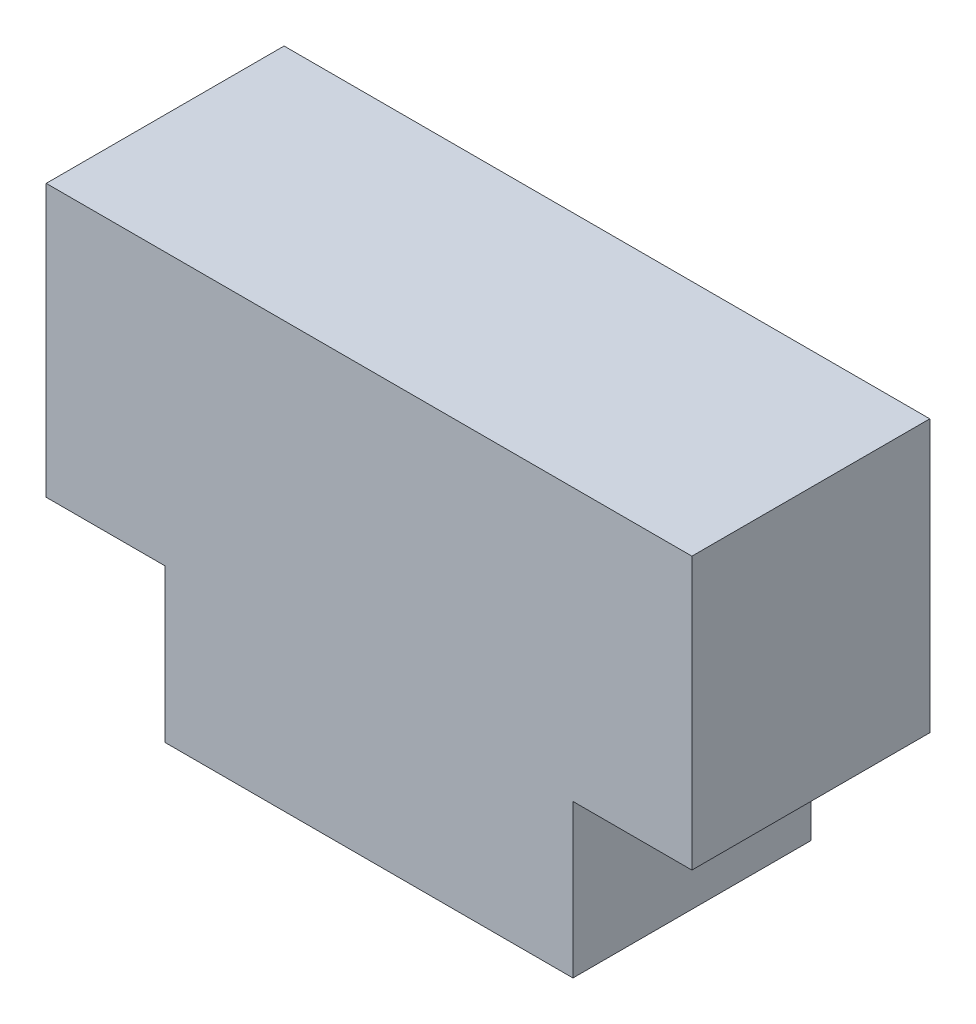
ISO-10303-21;
HEADER;
FILE_DESCRIPTION(('STEP AP214'),'2;1');
FILE_NAME('part.step','',(''),(''),'','','');
FILE_SCHEMA(('AUTOMOTIVE_DESIGN { 1 0 10303 214 1 1 1 1 }'));
ENDSEC;
DATA;
#1=APPLICATION_CONTEXT('core data for automotive mechanical design processes');
#2=APPLICATION_PROTOCOL_DEFINITION('international standard','automotive_design',2000,#1);
#3=PRODUCT_CONTEXT('',#1,'mechanical');
#4=PRODUCT('Part','Part','',(#3));
#5=PRODUCT_RELATED_PRODUCT_CATEGORY('part','',(#4));
#6=PRODUCT_DEFINITION_FORMATION('','',#4);
#7=PRODUCT_DEFINITION_CONTEXT('part definition',#1,'design');
#8=PRODUCT_DEFINITION('design','',#6,#7);
#9=PRODUCT_DEFINITION_SHAPE('','',#8);
#10=(LENGTH_UNIT() NAMED_UNIT(*) SI_UNIT(.MILLI.,.METRE.));
#11=(NAMED_UNIT(*) PLANE_ANGLE_UNIT() SI_UNIT($,.RADIAN.));
#12=(NAMED_UNIT(*) SI_UNIT($,.STERADIAN.) SOLID_ANGLE_UNIT());
#13=UNCERTAINTY_MEASURE_WITH_UNIT(LENGTH_MEASURE(1.E-05),#10,'distance_accuracy_value','');
#14=(GEOMETRIC_REPRESENTATION_CONTEXT(3) GLOBAL_UNCERTAINTY_ASSIGNED_CONTEXT((#13)) GLOBAL_UNIT_ASSIGNED_CONTEXT((#10,
#11,#12)) REPRESENTATION_CONTEXT('',''));
#15=CARTESIAN_POINT('',(0.,0.,0.));
#16=DIRECTION('',(0.,0.,1.));
#17=DIRECTION('',(1.,0.,0.));
#18=AXIS2_PLACEMENT_3D('',#15,#16,#17);
#19=CARTESIAN_POINT('',(0.95,-0.4,0.7));
#20=DIRECTION('',(-1.,0.,0.));
#21=DIRECTION('',(0.,0.,1.));
#22=AXIS2_PLACEMENT_3D('',#19,#20,#21);
#23=PLANE('',#22);
#24=DIRECTION('',(0.,1.,0.));
#25=VECTOR('',#24,1.);
#26=CARTESIAN_POINT('',(0.95,-0.4,0.));
#27=LINE('',#26,#25);
#28=CARTESIAN_POINT('',(0.95,-0.4,0.));
#29=VERTEX_POINT('',#28);
#30=CARTESIAN_POINT('',(0.95,0.4,0.));
#31=VERTEX_POINT('',#30);
#32=EDGE_CURVE('E130',#29,#31,#27,.T.);
#33=ORIENTED_EDGE('',*,*,#32,.T.);
#34=DIRECTION('',(0.,0.,-1.));
#35=VECTOR('',#34,1.);
#36=CARTESIAN_POINT('',(0.95,0.4,0.7));
#37=LINE('',#36,#35);
#38=CARTESIAN_POINT('',(0.95,0.4,0.7));
#39=VERTEX_POINT('',#38);
#40=EDGE_CURVE('E11',#39,#31,#37,.T.);
#41=ORIENTED_EDGE('',*,*,#40,.F.);
#42=DIRECTION('',(0.,1.,0.));
#43=VECTOR('',#42,1.);
#44=CARTESIAN_POINT('',(0.95,-0.4,0.7));
#45=LINE('',#44,#43);
#46=CARTESIAN_POINT('',(0.95,-0.4,0.7));
#47=VERTEX_POINT('',#46);
#48=EDGE_CURVE('E144',#47,#39,#45,.T.);
#49=ORIENTED_EDGE('',*,*,#48,.F.);
#50=DIRECTION('',(0.,0.,-1.));
#51=VECTOR('',#50,1.);
#52=CARTESIAN_POINT('',(0.95,-0.4,0.7));
#53=LINE('',#52,#51);
#54=EDGE_CURVE('E126',#47,#29,#53,.T.);
#55=ORIENTED_EDGE('',*,*,#54,.T.);
#56=EDGE_LOOP('',(#33,#41,#49,#55));
#57=FACE_BOUND('',#56,.T.);
#58=ADVANCED_FACE('F34',(#57),#23,.F.);
#59=CARTESIAN_POINT('',(0.95,0.4,0.7));
#60=DIRECTION('',(0.,-1.,0.));
#61=DIRECTION('',(0.,0.,-1.));
#62=AXIS2_PLACEMENT_3D('',#59,#60,#61);
#63=PLANE('',#62);
#64=DIRECTION('',(-1.,0.,0.));
#65=VECTOR('',#64,1.);
#66=CARTESIAN_POINT('',(0.95,0.4,0.));
#67=LINE('',#66,#65);
#68=CARTESIAN_POINT('',(-0.95,0.4,0.));
#69=VERTEX_POINT('',#68);
#70=EDGE_CURVE('E133',#31,#69,#67,.T.);
#71=ORIENTED_EDGE('',*,*,#70,.T.);
#72=DIRECTION('',(0.,0.,-1.));
#73=VECTOR('',#72,1.);
#74=CARTESIAN_POINT('',(-0.95,0.4,0.7));
#75=LINE('',#74,#73);
#76=CARTESIAN_POINT('',(-0.95,0.4,0.7));
#77=VERTEX_POINT('',#76);
#78=EDGE_CURVE('E42',#77,#69,#75,.T.);
#79=ORIENTED_EDGE('',*,*,#78,.F.);
#80=DIRECTION('',(-1.,0.,0.));
#81=VECTOR('',#80,1.);
#82=CARTESIAN_POINT('',(0.95,0.4,0.7));
#83=LINE('',#82,#81);
#84=EDGE_CURVE('E93',#39,#77,#83,.T.);
#85=ORIENTED_EDGE('',*,*,#84,.F.);
#86=ORIENTED_EDGE('',*,*,#40,.T.);
#87=EDGE_LOOP('',(#71,#79,#85,#86));
#88=FACE_BOUND('',#87,.T.);
#89=ADVANCED_FACE('F179',(#88),#63,.F.);
#90=CARTESIAN_POINT('',(-0.95,0.4,0.7));
#91=DIRECTION('',(1.,0.,0.));
#92=DIRECTION('',(0.,0.,-1.));
#93=AXIS2_PLACEMENT_3D('',#90,#91,#92);
#94=PLANE('',#93);
#95=DIRECTION('',(0.,-1.,0.));
#96=VECTOR('',#95,1.);
#97=CARTESIAN_POINT('',(-0.95,0.4,0.));
#98=LINE('',#97,#96);
#99=CARTESIAN_POINT('',(-0.95,-0.4,0.));
#100=VERTEX_POINT('',#99);
#101=EDGE_CURVE('E135',#69,#100,#98,.T.);
#102=ORIENTED_EDGE('',*,*,#101,.T.);
#103=DIRECTION('',(0.,0.,-1.));
#104=VECTOR('',#103,1.);
#105=CARTESIAN_POINT('',(-0.95,-0.4,0.7));
#106=LINE('',#105,#104);
#107=CARTESIAN_POINT('',(-0.95,-0.4,0.7));
#108=VERTEX_POINT('',#107);
#109=EDGE_CURVE('E151',#108,#100,#106,.T.);
#110=ORIENTED_EDGE('',*,*,#109,.F.);
#111=DIRECTION('',(0.,-1.,0.));
#112=VECTOR('',#111,1.);
#113=CARTESIAN_POINT('',(-0.95,0.4,0.7));
#114=LINE('',#113,#112);
#115=EDGE_CURVE('E159',#77,#108,#114,.T.);
#116=ORIENTED_EDGE('',*,*,#115,.F.);
#117=ORIENTED_EDGE('',*,*,#78,.T.);
#118=EDGE_LOOP('',(#102,#110,#116,#117));
#119=FACE_BOUND('',#118,.T.);
#120=ADVANCED_FACE('F157',(#119),#94,.F.);
#121=CARTESIAN_POINT('',(-0.95,-0.4,0.7));
#122=DIRECTION('',(0.,1.,0.));
#123=DIRECTION('',(0.,0.,1.));
#124=AXIS2_PLACEMENT_3D('',#121,#122,#123);
#125=PLANE('',#124);
#126=DIRECTION('',(1.,0.,0.));
#127=VECTOR('',#126,1.);
#128=CARTESIAN_POINT('',(-0.95,-0.4,0.));
#129=LINE('',#128,#127);
#130=CARTESIAN_POINT('',(-0.6,-0.4,0.));
#131=VERTEX_POINT('',#130);
#132=EDGE_CURVE('E137',#100,#131,#129,.T.);
#133=ORIENTED_EDGE('',*,*,#132,.T.);
#134=DIRECTION('',(0.,0.,-1.));
#135=VECTOR('',#134,1.);
#136=CARTESIAN_POINT('',(-0.6,-0.4,0.7));
#137=LINE('',#136,#135);
#138=CARTESIAN_POINT('',(-0.6,-0.4,0.7));
#139=VERTEX_POINT('',#138);
#140=EDGE_CURVE('E148',#139,#131,#137,.T.);
#141=ORIENTED_EDGE('',*,*,#140,.F.);
#142=DIRECTION('',(1.,0.,0.));
#143=VECTOR('',#142,1.);
#144=CARTESIAN_POINT('',(-0.95,-0.4,0.7));
#145=LINE('',#144,#143);
#146=EDGE_CURVE('E171',#108,#139,#145,.T.);
#147=ORIENTED_EDGE('',*,*,#146,.F.);
#148=ORIENTED_EDGE('',*,*,#109,.T.);
#149=EDGE_LOOP('',(#133,#141,#147,#148));
#150=FACE_BOUND('',#149,.T.);
#151=ADVANCED_FACE('F167',(#150),#125,.F.);
#152=CARTESIAN_POINT('',(-0.6,-0.4,0.7));
#153=DIRECTION('',(1.,0.,0.));
#154=DIRECTION('',(0.,0.,-1.));
#155=AXIS2_PLACEMENT_3D('',#152,#153,#154);
#156=PLANE('',#155);
#157=DIRECTION('',(0.,-1.,0.));
#158=VECTOR('',#157,1.);
#159=CARTESIAN_POINT('',(-0.6,-0.4,0.));
#160=LINE('',#159,#158);
#161=CARTESIAN_POINT('',(-0.6,-0.85,0.));
#162=VERTEX_POINT('',#161);
#163=EDGE_CURVE('E139',#131,#162,#160,.T.);
#164=ORIENTED_EDGE('',*,*,#163,.T.);
#165=DIRECTION('',(0.,0.,-1.));
#166=VECTOR('',#165,1.);
#167=CARTESIAN_POINT('',(-0.6,-0.85,0.7));
#168=LINE('',#167,#166);
#169=CARTESIAN_POINT('',(-0.6,-0.85,0.7));
#170=VERTEX_POINT('',#169);
#171=EDGE_CURVE('E121',#170,#162,#168,.T.);
#172=ORIENTED_EDGE('',*,*,#171,.F.);
#173=DIRECTION('',(0.,-1.,0.));
#174=VECTOR('',#173,1.);
#175=CARTESIAN_POINT('',(-0.6,-0.4,0.7));
#176=LINE('',#175,#174);
#177=EDGE_CURVE('E112',#139,#170,#176,.T.);
#178=ORIENTED_EDGE('',*,*,#177,.F.);
#179=ORIENTED_EDGE('',*,*,#140,.T.);
#180=EDGE_LOOP('',(#164,#172,#178,#179));
#181=FACE_BOUND('',#180,.T.);
#182=ADVANCED_FACE('F170',(#181),#156,.F.);
#183=CARTESIAN_POINT('',(-0.6,-0.85,0.7));
#184=DIRECTION('',(0.,1.,0.));
#185=DIRECTION('',(0.,0.,1.));
#186=AXIS2_PLACEMENT_3D('',#183,#184,#185);
#187=PLANE('',#186);
#188=DIRECTION('',(1.,0.,0.));
#189=VECTOR('',#188,1.);
#190=CARTESIAN_POINT('',(-0.6,-0.85,0.));
#191=LINE('',#190,#189);
#192=CARTESIAN_POINT('',(0.6,-0.85,0.));
#193=VERTEX_POINT('',#192);
#194=EDGE_CURVE('E120',#162,#193,#191,.T.);
#195=ORIENTED_EDGE('',*,*,#194,.T.);
#196=DIRECTION('',(0.,0.,-1.));
#197=VECTOR('',#196,1.);
#198=CARTESIAN_POINT('',(0.6,-0.85,0.7));
#199=LINE('',#198,#197);
#200=CARTESIAN_POINT('',(0.6,-0.85,0.7));
#201=VERTEX_POINT('',#200);
#202=EDGE_CURVE('E117',#201,#193,#199,.T.);
#203=ORIENTED_EDGE('',*,*,#202,.F.);
#204=DIRECTION('',(1.,0.,0.));
#205=VECTOR('',#204,1.);
#206=CARTESIAN_POINT('',(-0.6,-0.85,0.7));
#207=LINE('',#206,#205);
#208=EDGE_CURVE('E106',#170,#201,#207,.T.);
#209=ORIENTED_EDGE('',*,*,#208,.F.);
#210=ORIENTED_EDGE('',*,*,#171,.T.);
#211=EDGE_LOOP('',(#195,#203,#209,#210));
#212=FACE_BOUND('',#211,.T.);
#213=ADVANCED_FACE('F118',(#212),#187,.F.);
#214=CARTESIAN_POINT('',(0.6,-0.85,0.7));
#215=DIRECTION('',(-1.,0.,0.));
#216=DIRECTION('',(0.,0.,1.));
#217=AXIS2_PLACEMENT_3D('',#214,#215,#216);
#218=PLANE('',#217);
#219=DIRECTION('',(0.,1.,0.));
#220=VECTOR('',#219,1.);
#221=CARTESIAN_POINT('',(0.6,-0.85,0.));
#222=LINE('',#221,#220);
#223=CARTESIAN_POINT('',(0.6,-0.4,0.));
#224=VERTEX_POINT('',#223);
#225=EDGE_CURVE('E79',#193,#224,#222,.T.);
#226=ORIENTED_EDGE('',*,*,#225,.T.);
#227=DIRECTION('',(0.,0.,-1.));
#228=VECTOR('',#227,1.);
#229=CARTESIAN_POINT('',(0.6,-0.4,0.7));
#230=LINE('',#229,#228);
#231=CARTESIAN_POINT('',(0.6,-0.4,0.7));
#232=VERTEX_POINT('',#231);
#233=EDGE_CURVE('E122',#232,#224,#230,.T.);
#234=ORIENTED_EDGE('',*,*,#233,.F.);
#235=DIRECTION('',(0.,1.,0.));
#236=VECTOR('',#235,1.);
#237=CARTESIAN_POINT('',(0.6,-0.85,0.7));
#238=LINE('',#237,#236);
#239=EDGE_CURVE('E110',#201,#232,#238,.T.);
#240=ORIENTED_EDGE('',*,*,#239,.F.);
#241=ORIENTED_EDGE('',*,*,#202,.T.);
#242=EDGE_LOOP('',(#226,#234,#240,#241));
#243=FACE_BOUND('',#242,.T.);
#244=ADVANCED_FACE('F124',(#243),#218,.F.);
#245=CARTESIAN_POINT('',(0.6,-0.4,0.7));
#246=DIRECTION('',(0.,1.,0.));
#247=DIRECTION('',(0.,0.,1.));
#248=AXIS2_PLACEMENT_3D('',#245,#246,#247);
#249=PLANE('',#248);
#250=DIRECTION('',(1.,0.,0.));
#251=VECTOR('',#250,1.);
#252=CARTESIAN_POINT('',(0.6,-0.4,0.));
#253=LINE('',#252,#251);
#254=EDGE_CURVE('E85',#224,#29,#253,.T.);
#255=ORIENTED_EDGE('',*,*,#254,.T.);
#256=ORIENTED_EDGE('',*,*,#54,.F.);
#257=DIRECTION('',(1.,0.,0.));
#258=VECTOR('',#257,1.);
#259=CARTESIAN_POINT('',(0.6,-0.4,0.7));
#260=LINE('',#259,#258);
#261=EDGE_CURVE('E50',#232,#47,#260,.T.);
#262=ORIENTED_EDGE('',*,*,#261,.F.);
#263=ORIENTED_EDGE('',*,*,#233,.T.);
#264=EDGE_LOOP('',(#255,#256,#262,#263));
#265=FACE_BOUND('',#264,.T.);
#266=ADVANCED_FACE('F195',(#265),#249,.F.);
#267=CARTESIAN_POINT('',(0.,0.,0.7));
#268=DIRECTION('',(0.,0.,1.));
#269=DIRECTION('',(1.,0.,0.));
#270=AXIS2_PLACEMENT_3D('',#267,#268,#269);
#271=PLANE('',#270);
#272=ORIENTED_EDGE('',*,*,#48,.T.);
#273=ORIENTED_EDGE('',*,*,#84,.T.);
#274=ORIENTED_EDGE('',*,*,#115,.T.);
#275=ORIENTED_EDGE('',*,*,#146,.T.);
#276=ORIENTED_EDGE('',*,*,#177,.T.);
#277=ORIENTED_EDGE('',*,*,#208,.T.);
#278=ORIENTED_EDGE('',*,*,#239,.T.);
#279=ORIENTED_EDGE('',*,*,#261,.T.);
#280=EDGE_LOOP('',(#272,#273,#274,#275,#276,#277,#278,#279));
#281=FACE_BOUND('',#280,.T.);
#282=ADVANCED_FACE('F108',(#281),#271,.T.);
#283=CARTESIAN_POINT('',(0.,0.,0.));
#284=DIRECTION('',(0.,0.,1.));
#285=DIRECTION('',(1.,0.,0.));
#286=AXIS2_PLACEMENT_3D('',#283,#284,#285);
#287=PLANE('',#286);
#288=ORIENTED_EDGE('',*,*,#32,.F.);
#289=ORIENTED_EDGE('',*,*,#254,.F.);
#290=ORIENTED_EDGE('',*,*,#225,.F.);
#291=ORIENTED_EDGE('',*,*,#194,.F.);
#292=ORIENTED_EDGE('',*,*,#163,.F.);
#293=ORIENTED_EDGE('',*,*,#132,.F.);
#294=ORIENTED_EDGE('',*,*,#101,.F.);
#295=ORIENTED_EDGE('',*,*,#70,.F.);
#296=EDGE_LOOP('',(#288,#289,#290,#291,#292,#293,#294,#295));
#297=FACE_BOUND('',#296,.T.);
#298=ADVANCED_FACE('F163',(#297),#287,.F.);
#299=CLOSED_SHELL('',(#58,#89,#120,#151,#182,#213,#244,#266,#282,#298));
#300=MANIFOLD_SOLID_BREP('B2',#299);
#301=ADVANCED_BREP_SHAPE_REPRESENTATION('',(#18,#300),#14);
#302=SHAPE_DEFINITION_REPRESENTATION(#9,#301);
ENDSEC;
END-ISO-10303-21;
